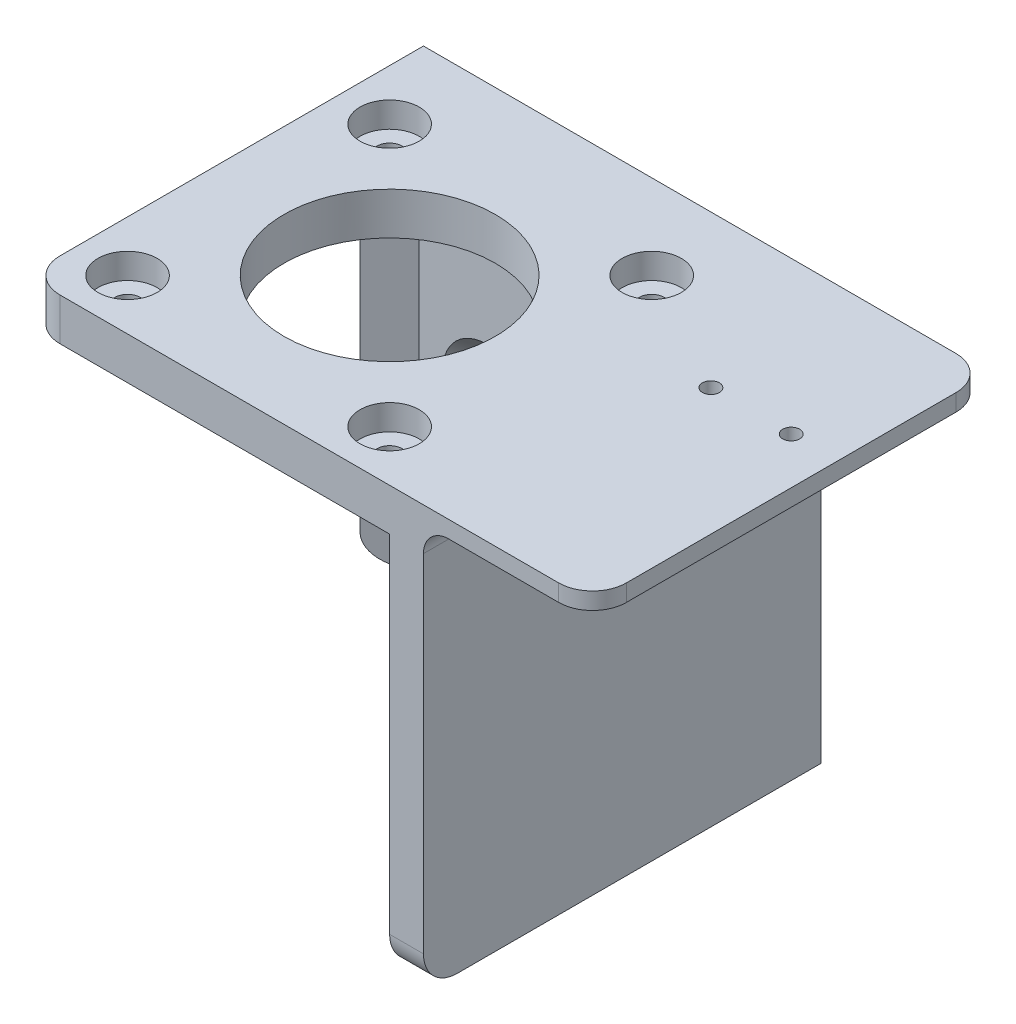
ISO-10303-21;
HEADER;
FILE_DESCRIPTION(('STEP AP214'),'2;1');
FILE_NAME('part.step','',(''),(''),'','','');
FILE_SCHEMA(('AUTOMOTIVE_DESIGN { 1 0 10303 214 1 1 1 1 }'));
ENDSEC;
DATA;
#1=APPLICATION_CONTEXT('core data for automotive mechanical design processes');
#2=APPLICATION_PROTOCOL_DEFINITION('international standard','automotive_design',2000,#1);
#3=PRODUCT_CONTEXT('',#1,'mechanical');
#4=PRODUCT('Part','Part','',(#3));
#5=PRODUCT_RELATED_PRODUCT_CATEGORY('part','',(#4));
#6=PRODUCT_DEFINITION_FORMATION('','',#4);
#7=PRODUCT_DEFINITION_CONTEXT('part definition',#1,'design');
#8=PRODUCT_DEFINITION('design','',#6,#7);
#9=PRODUCT_DEFINITION_SHAPE('','',#8);
#10=(LENGTH_UNIT() NAMED_UNIT(*) SI_UNIT(.MILLI.,.METRE.));
#11=(NAMED_UNIT(*) PLANE_ANGLE_UNIT() SI_UNIT($,.RADIAN.));
#12=(NAMED_UNIT(*) SI_UNIT($,.STERADIAN.) SOLID_ANGLE_UNIT());
#13=UNCERTAINTY_MEASURE_WITH_UNIT(LENGTH_MEASURE(1.E-05),#10,'distance_accuracy_value','');
#14=(GEOMETRIC_REPRESENTATION_CONTEXT(3) GLOBAL_UNCERTAINTY_ASSIGNED_CONTEXT((#13)) GLOBAL_UNIT_ASSIGNED_CONTEXT((#10,
#11,#12)) REPRESENTATION_CONTEXT('',''));
#15=CARTESIAN_POINT('',(0.,0.,0.));
#16=DIRECTION('',(0.,0.,1.));
#17=DIRECTION('',(1.,0.,0.));
#18=AXIS2_PLACEMENT_3D('',#15,#16,#17);
#19=CARTESIAN_POINT('',(0.,50.,0.));
#20=DIRECTION('',(0.,-1.,0.));
#21=DIRECTION('',(0.,0.,-1.));
#22=AXIS2_PLACEMENT_3D('',#19,#20,#21);
#23=PLANE('',#22);
#24=DIRECTION('',(0.,0.,-1.));
#25=VECTOR('',#24,1.);
#26=CARTESIAN_POINT('',(0.,50.,47.));
#27=LINE('',#26,#25);
#28=CARTESIAN_POINT('',(0.,50.,43.));
#29=VERTEX_POINT('',#28);
#30=CARTESIAN_POINT('',(0.,50.,0.));
#31=VERTEX_POINT('',#30);
#32=EDGE_CURVE('E203',#29,#31,#27,.T.);
#33=ORIENTED_EDGE('',*,*,#32,.F.);
#34=CARTESIAN_POINT('',(4.,50.,43.));
#35=DIRECTION('',(0.,-1.,0.));
#36=DIRECTION('',(0.,0.,-1.));
#37=AXIS2_PLACEMENT_3D('',#34,#35,#36);
#38=CIRCLE('',#37,4.);
#39=CARTESIAN_POINT('',(4.,50.,47.));
#40=VERTEX_POINT('',#39);
#41=EDGE_CURVE('E12',#29,#40,#38,.F.);
#42=ORIENTED_EDGE('',*,*,#41,.T.);
#43=DIRECTION('',(1.,0.,0.));
#44=VECTOR('',#43,1.);
#45=CARTESIAN_POINT('',(47.,50.,47.));
#46=LINE('',#45,#44);
#47=CARTESIAN_POINT('',(63.,50.,47.));
#48=VERTEX_POINT('',#47);
#49=EDGE_CURVE('E231',#40,#48,#46,.T.);
#50=ORIENTED_EDGE('',*,*,#49,.T.);
#51=CARTESIAN_POINT('',(63.,50.,43.));
#52=DIRECTION('',(0.,-1.,0.));
#53=DIRECTION('',(0.,0.,-1.));
#54=AXIS2_PLACEMENT_3D('',#51,#52,#53);
#55=CIRCLE('',#54,4.);
#56=CARTESIAN_POINT('',(67.,50.,43.));
#57=VERTEX_POINT('',#56);
#58=EDGE_CURVE('E436',#48,#57,#55,.F.);
#59=ORIENTED_EDGE('',*,*,#58,.T.);
#60=DIRECTION('',(0.,0.,1.));
#61=VECTOR('',#60,1.);
#62=CARTESIAN_POINT('',(67.,50.,0.));
#63=LINE('',#62,#61);
#64=CARTESIAN_POINT('',(67.,50.,4.));
#65=VERTEX_POINT('',#64);
#66=EDGE_CURVE('E713',#65,#57,#63,.T.);
#67=ORIENTED_EDGE('',*,*,#66,.F.);
#68=CARTESIAN_POINT('',(63.,50.,4.));
#69=DIRECTION('',(0.,-1.,0.));
#70=DIRECTION('',(0.,0.,-1.));
#71=AXIS2_PLACEMENT_3D('',#68,#69,#70);
#72=CIRCLE('',#71,4.);
#73=CARTESIAN_POINT('',(63.,50.,0.));
#74=VERTEX_POINT('',#73);
#75=EDGE_CURVE('E229',#65,#74,#72,.F.);
#76=ORIENTED_EDGE('',*,*,#75,.T.);
#77=DIRECTION('',(-1.,0.,0.));
#78=VECTOR('',#77,1.);
#79=CARTESIAN_POINT('',(47.,50.,0.));
#80=LINE('',#79,#78);
#81=EDGE_CURVE('E218',#74,#31,#80,.T.);
#82=ORIENTED_EDGE('',*,*,#81,.T.);
#83=EDGE_LOOP('',(#33,#42,#50,#59,#67,#76,#82));
#84=FACE_BOUND('',#83,.T.);
#85=CARTESIAN_POINT('',(6.,50.,10.));
#86=DIRECTION('',(0.,1.,0.));
#87=DIRECTION('',(0.,0.,1.));
#88=AXIS2_PLACEMENT_3D('',#85,#86,#87);
#89=CIRCLE('',#88,3.5);
#90=CARTESIAN_POINT('',(6.,50.,13.5));
#91=VERTEX_POINT('',#90);
#92=EDGE_CURVE('E232',#91,#91,#89,.T.);
#93=ORIENTED_EDGE('',*,*,#92,.F.);
#94=EDGE_LOOP('',(#93));
#95=FACE_BOUND('',#94,.T.);
#96=CARTESIAN_POINT('',(6.,50.,41.));
#97=DIRECTION('',(0.,1.,0.));
#98=DIRECTION('',(0.,0.,1.));
#99=AXIS2_PLACEMENT_3D('',#96,#97,#98);
#100=CIRCLE('',#99,3.5);
#101=CARTESIAN_POINT('',(6.,50.,44.5));
#102=VERTEX_POINT('',#101);
#103=EDGE_CURVE('E531',#102,#102,#100,.T.);
#104=ORIENTED_EDGE('',*,*,#103,.F.);
#105=EDGE_LOOP('',(#104));
#106=FACE_BOUND('',#105,.T.);
#107=CARTESIAN_POINT('',(37.,50.,10.));
#108=DIRECTION('',(0.,1.,0.));
#109=DIRECTION('',(0.,0.,1.));
#110=AXIS2_PLACEMENT_3D('',#107,#108,#109);
#111=CIRCLE('',#110,3.5);
#112=CARTESIAN_POINT('',(37.,50.,13.5));
#113=VERTEX_POINT('',#112);
#114=EDGE_CURVE('E523',#113,#113,#111,.T.);
#115=ORIENTED_EDGE('',*,*,#114,.F.);
#116=EDGE_LOOP('',(#115));
#117=FACE_BOUND('',#116,.T.);
#118=CARTESIAN_POINT('',(37.,50.,41.));
#119=DIRECTION('',(0.,1.,0.));
#120=DIRECTION('',(0.,0.,1.));
#121=AXIS2_PLACEMENT_3D('',#118,#119,#120);
#122=CIRCLE('',#121,3.5);
#123=CARTESIAN_POINT('',(37.,50.,44.5));
#124=VERTEX_POINT('',#123);
#125=EDGE_CURVE('E515',#124,#124,#122,.T.);
#126=ORIENTED_EDGE('',*,*,#125,.F.);
#127=EDGE_LOOP('',(#126));
#128=FACE_BOUND('',#127,.T.);
#129=CARTESIAN_POINT('',(21.5,50.,25.5));
#130=DIRECTION('',(0.,1.,0.));
#131=DIRECTION('',(0.,0.,1.));
#132=AXIS2_PLACEMENT_3D('',#129,#130,#131);
#133=CIRCLE('',#132,12.5);
#134=CARTESIAN_POINT('',(21.5,50.,38.));
#135=VERTEX_POINT('',#134);
#136=EDGE_CURVE('E503',#135,#135,#133,.T.);
#137=ORIENTED_EDGE('',*,*,#136,.F.);
#138=EDGE_LOOP('',(#137));
#139=FACE_BOUND('',#138,.T.);
#140=CARTESIAN_POINT('',(52.,50.,18.));
#141=DIRECTION('',(0.,1.,0.));
#142=DIRECTION('',(0.,0.,1.));
#143=AXIS2_PLACEMENT_3D('',#140,#141,#142);
#144=CIRCLE('',#143,0.999999999999987);
#145=CARTESIAN_POINT('',(52.,50.,19.));
#146=VERTEX_POINT('',#145);
#147=EDGE_CURVE('E696',#146,#146,#144,.T.);
#148=ORIENTED_EDGE('',*,*,#147,.F.);
#149=EDGE_LOOP('',(#148));
#150=FACE_BOUND('',#149,.T.);
#151=CARTESIAN_POINT('',(61.5,50.,18.));
#152=DIRECTION('',(0.,1.,0.));
#153=DIRECTION('',(0.,0.,1.));
#154=AXIS2_PLACEMENT_3D('',#151,#152,#153);
#155=CIRCLE('',#154,0.999999999999987);
#156=CARTESIAN_POINT('',(61.5,50.,19.));
#157=VERTEX_POINT('',#156);
#158=EDGE_CURVE('E212',#157,#157,#155,.T.);
#159=ORIENTED_EDGE('',*,*,#158,.F.);
#160=EDGE_LOOP('',(#159));
#161=FACE_BOUND('',#160,.T.);
#162=ADVANCED_FACE('F88',(#84,#95,#106,#117,#128,#139,#150,#161),#23,.F.);
#163=CARTESIAN_POINT('',(47.,0.,4.));
#164=DIRECTION('',(-1.,0.,0.));
#165=DIRECTION('',(0.,0.,1.));
#166=AXIS2_PLACEMENT_3D('',#163,#164,#165);
#167=PLANE('',#166);
#168=DIRECTION('',(0.,1.,0.));
#169=VECTOR('',#168,1.);
#170=CARTESIAN_POINT('',(47.,0.,0.));
#171=LINE('',#170,#169);
#172=CARTESIAN_POINT('',(47.,0.,0.));
#173=VERTEX_POINT('',#172);
#174=CARTESIAN_POINT('',(47.,45.,0.));
#175=VERTEX_POINT('',#174);
#176=EDGE_CURVE('E378',#173,#175,#171,.T.);
#177=ORIENTED_EDGE('',*,*,#176,.T.);
#178=DIRECTION('',(0.,0.,-1.));
#179=VECTOR('',#178,1.);
#180=CARTESIAN_POINT('',(47.,45.,47.));
#181=LINE('',#180,#179);
#182=CARTESIAN_POINT('',(47.,45.,47.));
#183=VERTEX_POINT('',#182);
#184=EDGE_CURVE('E446',#175,#183,#181,.F.);
#185=ORIENTED_EDGE('',*,*,#184,.T.);
#186=DIRECTION('',(0.,1.,0.));
#187=VECTOR('',#186,1.);
#188=CARTESIAN_POINT('',(47.,47.,47.));
#189=LINE('',#188,#187);
#190=CARTESIAN_POINT('',(47.,4.,47.));
#191=VERTEX_POINT('',#190);
#192=EDGE_CURVE('E367',#191,#183,#189,.T.);
#193=ORIENTED_EDGE('',*,*,#192,.F.);
#194=CARTESIAN_POINT('',(47.,4.,43.));
#195=DIRECTION('',(-1.,0.,0.));
#196=DIRECTION('',(0.,0.,1.));
#197=AXIS2_PLACEMENT_3D('',#194,#195,#196);
#198=CIRCLE('',#197,4.);
#199=CARTESIAN_POINT('',(47.,0.,43.));
#200=VERTEX_POINT('',#199);
#201=EDGE_CURVE('E410',#191,#200,#198,.F.);
#202=ORIENTED_EDGE('',*,*,#201,.T.);
#203=DIRECTION('',(0.,0.,-1.));
#204=VECTOR('',#203,1.);
#205=CARTESIAN_POINT('',(47.,0.,4.));
#206=LINE('',#205,#204);
#207=EDGE_CURVE('E377',#200,#173,#206,.T.);
#208=ORIENTED_EDGE('',*,*,#207,.T.);
#209=EDGE_LOOP('',(#177,#185,#193,#202,#208));
#210=FACE_BOUND('',#209,.T.);
#211=ADVANCED_FACE('F482',(#210),#167,.F.);
#212=CARTESIAN_POINT('',(0.,47.,4.));
#213=DIRECTION('',(0.,-1.,0.));
#214=DIRECTION('',(0.,0.,-1.));
#215=AXIS2_PLACEMENT_3D('',#212,#213,#214);
#216=PLANE('',#215);
#217=CARTESIAN_POINT('',(37.,47.,41.));
#218=DIRECTION('',(0.,1.,0.));
#219=DIRECTION('',(0.,0.,1.));
#220=AXIS2_PLACEMENT_3D('',#217,#218,#219);
#221=CIRCLE('',#220,1.5);
#222=CARTESIAN_POINT('',(37.,47.,42.5));
#223=VERTEX_POINT('',#222);
#224=EDGE_CURVE('E332',#223,#223,#221,.T.);
#225=ORIENTED_EDGE('',*,*,#224,.F.);
#226=EDGE_LOOP('',(#225));
#227=FACE_BOUND('',#226,.T.);
#228=CARTESIAN_POINT('',(37.,47.,41.));
#229=DIRECTION('',(0.,1.,0.));
#230=DIRECTION('',(0.,0.,1.));
#231=AXIS2_PLACEMENT_3D('',#228,#229,#230);
#232=CIRCLE('',#231,3.5);
#233=CARTESIAN_POINT('',(37.,47.,44.5));
#234=VERTEX_POINT('',#233);
#235=EDGE_CURVE('E509',#234,#234,#232,.T.);
#236=ORIENTED_EDGE('',*,*,#235,.T.);
#237=EDGE_LOOP('',(#236));
#238=FACE_BOUND('',#237,.T.);
#239=ADVANCED_FACE('F564',(#227,#238),#216,.F.);
#240=CARTESIAN_POINT('',(6.,47.,41.));
#241=DIRECTION('',(0.,1.,0.));
#242=DIRECTION('',(0.,0.,1.));
#243=AXIS2_PLACEMENT_3D('',#240,#241,#242);
#244=CIRCLE('',#243,1.5);
#245=CARTESIAN_POINT('',(6.,47.,42.5));
#246=VERTEX_POINT('',#245);
#247=EDGE_CURVE('E340',#246,#246,#244,.T.);
#248=ORIENTED_EDGE('',*,*,#247,.F.);
#249=EDGE_LOOP('',(#248));
#250=FACE_BOUND('',#249,.T.);
#251=CARTESIAN_POINT('',(6.,47.,41.));
#252=DIRECTION('',(0.,1.,0.));
#253=DIRECTION('',(0.,0.,1.));
#254=AXIS2_PLACEMENT_3D('',#251,#252,#253);
#255=CIRCLE('',#254,3.5);
#256=CARTESIAN_POINT('',(6.,47.,44.5));
#257=VERTEX_POINT('',#256);
#258=EDGE_CURVE('E527',#257,#257,#255,.T.);
#259=ORIENTED_EDGE('',*,*,#258,.T.);
#260=EDGE_LOOP('',(#259));
#261=FACE_BOUND('',#260,.T.);
#262=ADVANCED_FACE('F539',(#250,#261),#216,.F.);
#263=CARTESIAN_POINT('',(6.,47.,10.));
#264=DIRECTION('',(0.,1.,0.));
#265=DIRECTION('',(0.,0.,1.));
#266=AXIS2_PLACEMENT_3D('',#263,#264,#265);
#267=CIRCLE('',#266,1.5);
#268=CARTESIAN_POINT('',(6.,47.,11.5));
#269=VERTEX_POINT('',#268);
#270=EDGE_CURVE('E316',#269,#269,#267,.T.);
#271=ORIENTED_EDGE('',*,*,#270,.F.);
#272=EDGE_LOOP('',(#271));
#273=FACE_BOUND('',#272,.T.);
#274=CARTESIAN_POINT('',(6.,47.,10.));
#275=DIRECTION('',(0.,1.,0.));
#276=DIRECTION('',(0.,0.,1.));
#277=AXIS2_PLACEMENT_3D('',#274,#275,#276);
#278=CIRCLE('',#277,3.5);
#279=CARTESIAN_POINT('',(6.,47.,13.5));
#280=VERTEX_POINT('',#279);
#281=EDGE_CURVE('E239',#280,#280,#278,.T.);
#282=ORIENTED_EDGE('',*,*,#281,.T.);
#283=EDGE_LOOP('',(#282));
#284=FACE_BOUND('',#283,.T.);
#285=ADVANCED_FACE('F978',(#273,#284),#216,.F.);
#286=CARTESIAN_POINT('',(37.,47.,10.));
#287=DIRECTION('',(0.,1.,0.));
#288=DIRECTION('',(0.,0.,1.));
#289=AXIS2_PLACEMENT_3D('',#286,#287,#288);
#290=CIRCLE('',#289,1.5);
#291=CARTESIAN_POINT('',(37.,47.,11.5));
#292=VERTEX_POINT('',#291);
#293=EDGE_CURVE('E324',#292,#292,#290,.T.);
#294=ORIENTED_EDGE('',*,*,#293,.F.);
#295=EDGE_LOOP('',(#294));
#296=FACE_BOUND('',#295,.T.);
#297=CARTESIAN_POINT('',(37.,47.,10.));
#298=DIRECTION('',(0.,1.,0.));
#299=DIRECTION('',(0.,0.,1.));
#300=AXIS2_PLACEMENT_3D('',#297,#298,#299);
#301=CIRCLE('',#300,3.5);
#302=CARTESIAN_POINT('',(37.,47.,13.5));
#303=VERTEX_POINT('',#302);
#304=EDGE_CURVE('E519',#303,#303,#301,.T.);
#305=ORIENTED_EDGE('',*,*,#304,.T.);
#306=EDGE_LOOP('',(#305));
#307=FACE_BOUND('',#306,.T.);
#308=ADVANCED_FACE('F634',(#296,#307),#216,.F.);
#309=CARTESIAN_POINT('',(0.,0.,4.));
#310=DIRECTION('',(0.,0.,-1.));
#311=DIRECTION('',(-1.,0.,0.));
#312=AXIS2_PLACEMENT_3D('',#309,#310,#311);
#313=PLANE('',#312);
#314=CARTESIAN_POINT('',(21.5,12.,4.));
#315=DIRECTION('',(0.,0.,1.));
#316=DIRECTION('',(1.,0.,0.));
#317=AXIS2_PLACEMENT_3D('',#314,#315,#316);
#318=CIRCLE('',#317,5.2);
#319=CARTESIAN_POINT('',(26.7,12.,4.));
#320=VERTEX_POINT('',#319);
#321=EDGE_CURVE('E304',#320,#320,#318,.T.);
#322=ORIENTED_EDGE('',*,*,#321,.F.);
#323=EDGE_LOOP('',(#322));
#324=FACE_BOUND('',#323,.T.);
#325=CARTESIAN_POINT('',(31.5,22.,4.));
#326=DIRECTION('',(0.,0.,1.));
#327=DIRECTION('',(1.,0.,0.));
#328=AXIS2_PLACEMENT_3D('',#325,#326,#327);
#329=CIRCLE('',#328,5.2);
#330=CARTESIAN_POINT('',(36.7,22.,4.));
#331=VERTEX_POINT('',#330);
#332=EDGE_CURVE('E292',#331,#331,#329,.T.);
#333=ORIENTED_EDGE('',*,*,#332,.F.);
#334=EDGE_LOOP('',(#333));
#335=FACE_BOUND('',#334,.T.);
#336=CARTESIAN_POINT('',(21.5,32.,4.));
#337=DIRECTION('',(0.,0.,1.));
#338=DIRECTION('',(1.,0.,0.));
#339=AXIS2_PLACEMENT_3D('',#336,#337,#338);
#340=CIRCLE('',#339,5.2);
#341=CARTESIAN_POINT('',(26.7,32.,4.));
#342=VERTEX_POINT('',#341);
#343=EDGE_CURVE('E280',#342,#342,#340,.T.);
#344=ORIENTED_EDGE('',*,*,#343,.F.);
#345=EDGE_LOOP('',(#344));
#346=FACE_BOUND('',#345,.T.);
#347=CARTESIAN_POINT('',(11.5,22.,4.));
#348=DIRECTION('',(0.,0.,1.));
#349=DIRECTION('',(1.,0.,0.));
#350=AXIS2_PLACEMENT_3D('',#347,#348,#349);
#351=CIRCLE('',#350,5.2);
#352=CARTESIAN_POINT('',(16.7,22.,4.));
#353=VERTEX_POINT('',#352);
#354=EDGE_CURVE('E268',#353,#353,#351,.T.);
#355=ORIENTED_EDGE('',*,*,#354,.F.);
#356=EDGE_LOOP('',(#355));
#357=FACE_BOUND('',#356,.T.);
#358=DIRECTION('',(0.,1.,0.));
#359=VECTOR('',#358,1.);
#360=CARTESIAN_POINT('',(3.5,0.,4.));
#361=LINE('',#360,#359);
#362=CARTESIAN_POINT('',(3.5,0.0313730334031148,4.));
#363=VERTEX_POINT('',#362);
#364=CARTESIAN_POINT('',(3.5,45.,4.));
#365=VERTEX_POINT('',#364);
#366=EDGE_CURVE('E250',#363,#365,#361,.T.);
#367=ORIENTED_EDGE('',*,*,#366,.F.);
#368=CARTESIAN_POINT('',(4.,4.,4.));
#369=DIRECTION('',(0.,0.,-1.));
#370=DIRECTION('',(-1.,0.,0.));
#371=AXIS2_PLACEMENT_3D('',#368,#369,#370);
#372=CIRCLE('',#371,4.);
#373=CARTESIAN_POINT('',(4.,0.,4.));
#374=VERTEX_POINT('',#373);
#375=EDGE_CURVE('E407',#363,#374,#372,.F.);
#376=ORIENTED_EDGE('',*,*,#375,.T.);
#377=DIRECTION('',(1.,0.,0.));
#378=VECTOR('',#377,1.);
#379=CARTESIAN_POINT('',(0.,0.,4.));
#380=LINE('',#379,#378);
#381=CARTESIAN_POINT('',(39.5,0.,4.));
#382=VERTEX_POINT('',#381);
#383=EDGE_CURVE('E375',#374,#382,#380,.T.);
#384=ORIENTED_EDGE('',*,*,#383,.T.);
#385=DIRECTION('',(0.,1.,0.));
#386=VECTOR('',#385,1.);
#387=CARTESIAN_POINT('',(39.5,0.,4.));
#388=LINE('',#387,#386);
#389=CARTESIAN_POINT('',(39.5,45.,4.));
#390=VERTEX_POINT('',#389);
#391=EDGE_CURVE('E258',#382,#390,#388,.T.);
#392=ORIENTED_EDGE('',*,*,#391,.T.);
#393=DIRECTION('',(1.,0.,0.));
#394=VECTOR('',#393,1.);
#395=CARTESIAN_POINT('',(0.,45.,4.));
#396=LINE('',#395,#394);
#397=EDGE_CURVE('E363',#365,#390,#396,.T.);
#398=ORIENTED_EDGE('',*,*,#397,.F.);
#399=EDGE_LOOP('',(#367,#376,#384,#392,#398));
#400=FACE_BOUND('',#399,.T.);
#401=ADVANCED_FACE('F630',(#324,#335,#346,#357,#400),#313,.F.);
#402=CARTESIAN_POINT('',(0.,45.,47.));
#403=DIRECTION('',(0.,1.,0.));
#404=DIRECTION('',(0.,0.,1.));
#405=AXIS2_PLACEMENT_3D('',#402,#403,#404);
#406=PLANE('',#405);
#407=CARTESIAN_POINT('',(6.,45.,10.));
#408=DIRECTION('',(0.,1.,0.));
#409=DIRECTION('',(0.,0.,1.));
#410=AXIS2_PLACEMENT_3D('',#407,#408,#409);
#411=CIRCLE('',#410,1.5);
#412=CARTESIAN_POINT('',(6.,45.,11.5));
#413=VERTEX_POINT('',#412);
#414=EDGE_CURVE('E320',#413,#413,#411,.T.);
#415=ORIENTED_EDGE('',*,*,#414,.T.);
#416=EDGE_LOOP('',(#415));
#417=FACE_BOUND('',#416,.T.);
#418=CARTESIAN_POINT('',(37.,45.,10.));
#419=DIRECTION('',(0.,1.,0.));
#420=DIRECTION('',(0.,0.,1.));
#421=AXIS2_PLACEMENT_3D('',#418,#419,#420);
#422=CIRCLE('',#421,1.5);
#423=CARTESIAN_POINT('',(37.,45.,11.5));
#424=VERTEX_POINT('',#423);
#425=EDGE_CURVE('E328',#424,#424,#422,.T.);
#426=ORIENTED_EDGE('',*,*,#425,.T.);
#427=EDGE_LOOP('',(#426));
#428=FACE_BOUND('',#427,.T.);
#429=CARTESIAN_POINT('',(37.,45.,41.));
#430=DIRECTION('',(0.,1.,0.));
#431=DIRECTION('',(0.,0.,1.));
#432=AXIS2_PLACEMENT_3D('',#429,#430,#431);
#433=CIRCLE('',#432,1.5);
#434=CARTESIAN_POINT('',(37.,45.,42.5));
#435=VERTEX_POINT('',#434);
#436=EDGE_CURVE('E336',#435,#435,#433,.T.);
#437=ORIENTED_EDGE('',*,*,#436,.T.);
#438=EDGE_LOOP('',(#437));
#439=FACE_BOUND('',#438,.T.);
#440=CARTESIAN_POINT('',(6.,45.,41.));
#441=DIRECTION('',(0.,1.,0.));
#442=DIRECTION('',(0.,0.,1.));
#443=AXIS2_PLACEMENT_3D('',#440,#441,#442);
#444=CIRCLE('',#443,1.5);
#445=CARTESIAN_POINT('',(6.,45.,42.5));
#446=VERTEX_POINT('',#445);
#447=EDGE_CURVE('E344',#446,#446,#444,.T.);
#448=ORIENTED_EDGE('',*,*,#447,.T.);
#449=EDGE_LOOP('',(#448));
#450=FACE_BOUND('',#449,.T.);
#451=CARTESIAN_POINT('',(21.5,45.,25.5));
#452=DIRECTION('',(0.,-1.,0.));
#453=DIRECTION('',(0.,0.,-1.));
#454=AXIS2_PLACEMENT_3D('',#451,#452,#453);
#455=CIRCLE('',#454,12.5);
#456=CARTESIAN_POINT('',(21.5,45.,13.));
#457=VERTEX_POINT('',#456);
#458=EDGE_CURVE('E348',#457,#457,#455,.T.);
#459=ORIENTED_EDGE('',*,*,#458,.F.);
#460=EDGE_LOOP('',(#459));
#461=FACE_BOUND('',#460,.T.);
#462=DIRECTION('',(1.,0.,0.));
#463=VECTOR('',#462,1.);
#464=CARTESIAN_POINT('',(0.,45.,47.));
#465=LINE('',#464,#463);
#466=CARTESIAN_POINT('',(4.,45.,47.));
#467=VERTEX_POINT('',#466);
#468=CARTESIAN_POINT('',(43.,45.,47.));
#469=VERTEX_POINT('',#468);
#470=EDGE_CURVE('E364',#467,#469,#465,.T.);
#471=ORIENTED_EDGE('',*,*,#470,.F.);
#472=CARTESIAN_POINT('',(4.,45.,43.));
#473=DIRECTION('',(0.,1.,0.));
#474=DIRECTION('',(0.,0.,1.));
#475=AXIS2_PLACEMENT_3D('',#472,#473,#474);
#476=CIRCLE('',#475,4.);
#477=CARTESIAN_POINT('',(0.,45.,43.));
#478=VERTEX_POINT('',#477);
#479=EDGE_CURVE('E111',#467,#478,#476,.F.);
#480=ORIENTED_EDGE('',*,*,#479,.T.);
#481=DIRECTION('',(0.,0.,-1.));
#482=VECTOR('',#481,1.);
#483=CARTESIAN_POINT('',(0.,45.,47.));
#484=LINE('',#483,#482);
#485=CARTESIAN_POINT('',(0.,45.,7.5));
#486=VERTEX_POINT('',#485);
#487=EDGE_CURVE('E225',#478,#486,#484,.T.);
#488=ORIENTED_EDGE('',*,*,#487,.T.);
#489=DIRECTION('',(-0.707106781186548,0.,0.707106781186547));
#490=VECTOR('',#489,1.);
#491=CARTESIAN_POINT('',(3.5,45.,4.));
#492=LINE('',#491,#490);
#493=EDGE_CURVE('E236',#365,#486,#492,.T.);
#494=ORIENTED_EDGE('',*,*,#493,.F.);
#495=ORIENTED_EDGE('',*,*,#397,.T.);
#496=DIRECTION('',(-0.707106781186548,0.,-0.707106781186547));
#497=VECTOR('',#496,1.);
#498=CARTESIAN_POINT('',(39.5,45.,4.));
#499=LINE('',#498,#497);
#500=CARTESIAN_POINT('',(43.,45.,7.5));
#501=VERTEX_POINT('',#500);
#502=EDGE_CURVE('E253',#501,#390,#499,.T.);
#503=ORIENTED_EDGE('',*,*,#502,.F.);
#504=DIRECTION('',(0.,0.,-1.));
#505=VECTOR('',#504,1.);
#506=CARTESIAN_POINT('',(43.,45.,47.));
#507=LINE('',#506,#505);
#508=EDGE_CURVE('E359',#469,#501,#507,.T.);
#509=ORIENTED_EDGE('',*,*,#508,.F.);
#510=EDGE_LOOP('',(#471,#480,#488,#494,#495,#503,#509));
#511=FACE_BOUND('',#510,.T.);
#512=ADVANCED_FACE('F468',(#417,#428,#439,#450,#461,#511),#406,.F.);
#513=CARTESIAN_POINT('',(43.,45.,47.));
#514=DIRECTION('',(1.,0.,0.));
#515=DIRECTION('',(0.,1.,0.));
#516=AXIS2_PLACEMENT_3D('',#513,#514,#515);
#517=PLANE('',#516);
#518=DIRECTION('',(0.,0.,-1.));
#519=VECTOR('',#518,1.);
#520=CARTESIAN_POINT('',(43.,0.,47.));
#521=LINE('',#520,#519);
#522=CARTESIAN_POINT('',(43.,0.,43.));
#523=VERTEX_POINT('',#522);
#524=CARTESIAN_POINT('',(43.,0.,7.5));
#525=VERTEX_POINT('',#524);
#526=EDGE_CURVE('E356',#523,#525,#521,.T.);
#527=ORIENTED_EDGE('',*,*,#526,.F.);
#528=CARTESIAN_POINT('',(43.,4.,43.));
#529=DIRECTION('',(1.,0.,0.));
#530=DIRECTION('',(0.,1.,0.));
#531=AXIS2_PLACEMENT_3D('',#528,#529,#530);
#532=CIRCLE('',#531,4.);
#533=CARTESIAN_POINT('',(43.,4.00000000000002,47.));
#534=VERTEX_POINT('',#533);
#535=EDGE_CURVE('E413',#523,#534,#532,.F.);
#536=ORIENTED_EDGE('',*,*,#535,.T.);
#537=DIRECTION('',(0.,-1.,0.));
#538=VECTOR('',#537,1.);
#539=CARTESIAN_POINT('',(43.,45.,47.));
#540=LINE('',#539,#538);
#541=EDGE_CURVE('E352',#469,#534,#540,.T.);
#542=ORIENTED_EDGE('',*,*,#541,.F.);
#543=ORIENTED_EDGE('',*,*,#508,.T.);
#544=DIRECTION('',(0.,1.,0.));
#545=VECTOR('',#544,1.);
#546=CARTESIAN_POINT('',(43.,0.,7.5));
#547=LINE('',#546,#545);
#548=EDGE_CURVE('E265',#525,#501,#547,.T.);
#549=ORIENTED_EDGE('',*,*,#548,.F.);
#550=EDGE_LOOP('',(#527,#536,#542,#543,#549));
#551=FACE_BOUND('',#550,.T.);
#552=ADVANCED_FACE('F473',(#551),#517,.F.);
#553=CARTESIAN_POINT('',(0.,0.,4.));
#554=DIRECTION('',(1.,0.,0.));
#555=DIRECTION('',(0.,0.,-1.));
#556=AXIS2_PLACEMENT_3D('',#553,#554,#555);
#557=PLANE('',#556);
#558=ORIENTED_EDGE('',*,*,#487,.F.);
#559=DIRECTION('',(0.,-1.,0.));
#560=VECTOR('',#559,1.);
#561=CARTESIAN_POINT('',(0.,50.,43.));
#562=LINE('',#561,#560);
#563=EDGE_CURVE('E97',#478,#29,#562,.F.);
#564=ORIENTED_EDGE('',*,*,#563,.T.);
#565=ORIENTED_EDGE('',*,*,#32,.T.);
#566=DIRECTION('',(0.,-1.,0.));
#567=VECTOR('',#566,1.);
#568=CARTESIAN_POINT('',(0.,0.,0.));
#569=LINE('',#568,#567);
#570=CARTESIAN_POINT('',(0.,4.,0.));
#571=VERTEX_POINT('',#570);
#572=EDGE_CURVE('E206',#31,#571,#569,.T.);
#573=ORIENTED_EDGE('',*,*,#572,.T.);
#574=DIRECTION('',(0.,0.,-1.));
#575=VECTOR('',#574,1.);
#576=CARTESIAN_POINT('',(0.,4.,4.));
#577=LINE('',#576,#575);
#578=CARTESIAN_POINT('',(0.,4.,7.5));
#579=VERTEX_POINT('',#578);
#580=EDGE_CURVE('E401',#571,#579,#577,.F.);
#581=ORIENTED_EDGE('',*,*,#580,.T.);
#582=DIRECTION('',(0.,1.,0.));
#583=VECTOR('',#582,1.);
#584=CARTESIAN_POINT('',(0.,0.,7.5));
#585=LINE('',#584,#583);
#586=EDGE_CURVE('E246',#579,#486,#585,.T.);
#587=ORIENTED_EDGE('',*,*,#586,.T.);
#588=EDGE_LOOP('',(#558,#564,#565,#573,#581,#587));
#589=FACE_BOUND('',#588,.T.);
#590=ADVANCED_FACE('F205',(#589),#557,.F.);
#591=CARTESIAN_POINT('',(0.,0.,4.));
#592=DIRECTION('',(0.,1.,0.));
#593=DIRECTION('',(0.,0.,1.));
#594=AXIS2_PLACEMENT_3D('',#591,#592,#593);
#595=PLANE('',#594);
#596=ORIENTED_EDGE('',*,*,#383,.F.);
#597=DIRECTION('',(0.,0.,-1.));
#598=VECTOR('',#597,1.);
#599=CARTESIAN_POINT('',(4.,0.,4.));
#600=LINE('',#599,#598);
#601=CARTESIAN_POINT('',(4.,0.,0.));
#602=VERTEX_POINT('',#601);
#603=EDGE_CURVE('E397',#374,#602,#600,.T.);
#604=ORIENTED_EDGE('',*,*,#603,.T.);
#605=DIRECTION('',(1.,0.,0.));
#606=VECTOR('',#605,1.);
#607=CARTESIAN_POINT('',(0.,0.,0.));
#608=LINE('',#607,#606);
#609=EDGE_CURVE('E224',#602,#173,#608,.T.);
#610=ORIENTED_EDGE('',*,*,#609,.T.);
#611=ORIENTED_EDGE('',*,*,#207,.F.);
#612=DIRECTION('',(1.,0.,0.));
#613=VECTOR('',#612,1.);
#614=CARTESIAN_POINT('',(43.,0.,43.));
#615=LINE('',#614,#613);
#616=EDGE_CURVE('E394',#200,#523,#615,.F.);
#617=ORIENTED_EDGE('',*,*,#616,.T.);
#618=ORIENTED_EDGE('',*,*,#526,.T.);
#619=DIRECTION('',(-0.707106781186548,0.,-0.707106781186547));
#620=VECTOR('',#619,1.);
#621=CARTESIAN_POINT('',(39.5,0.,4.));
#622=LINE('',#621,#620);
#623=EDGE_CURVE('E254',#525,#382,#622,.T.);
#624=ORIENTED_EDGE('',*,*,#623,.T.);
#625=EDGE_LOOP('',(#596,#604,#610,#611,#617,#618,#624));
#626=FACE_BOUND('',#625,.T.);
#627=ADVANCED_FACE('F485',(#626),#595,.F.);
#628=CARTESIAN_POINT('',(0.,0.,0.));
#629=DIRECTION('',(0.,0.,-1.));
#630=DIRECTION('',(-1.,0.,0.));
#631=AXIS2_PLACEMENT_3D('',#628,#629,#630);
#632=PLANE('',#631);
#633=ORIENTED_EDGE('',*,*,#572,.F.);
#634=ORIENTED_EDGE('',*,*,#81,.F.);
#635=DIRECTION('',(0.,1.,0.));
#636=VECTOR('',#635,1.);
#637=CARTESIAN_POINT('',(63.,48.,0.));
#638=LINE('',#637,#636);
#639=CARTESIAN_POINT('',(63.,48.,0.));
#640=VERTEX_POINT('',#639);
#641=EDGE_CURVE('E439',#74,#640,#638,.F.);
#642=ORIENTED_EDGE('',*,*,#641,.T.);
#643=DIRECTION('',(-1.,0.,0.));
#644=VECTOR('',#643,1.);
#645=CARTESIAN_POINT('',(67.,48.,0.));
#646=LINE('',#645,#644);
#647=CARTESIAN_POINT('',(50.,48.,0.));
#648=VERTEX_POINT('',#647);
#649=EDGE_CURVE('E504',#640,#648,#646,.T.);
#650=ORIENTED_EDGE('',*,*,#649,.T.);
#651=CARTESIAN_POINT('',(50.,45.,0.));
#652=DIRECTION('',(0.,0.,-1.));
#653=DIRECTION('',(-1.,0.,0.));
#654=AXIS2_PLACEMENT_3D('',#651,#652,#653);
#655=CIRCLE('',#654,3.);
#656=EDGE_CURVE('E449',#648,#175,#655,.F.);
#657=ORIENTED_EDGE('',*,*,#656,.T.);
#658=ORIENTED_EDGE('',*,*,#176,.F.);
#659=ORIENTED_EDGE('',*,*,#609,.F.);
#660=CARTESIAN_POINT('',(4.,4.,0.));
#661=DIRECTION('',(0.,0.,-1.));
#662=DIRECTION('',(-1.,0.,0.));
#663=AXIS2_PLACEMENT_3D('',#660,#661,#662);
#664=CIRCLE('',#663,4.);
#665=EDGE_CURVE('E221',#602,#571,#664,.T.);
#666=ORIENTED_EDGE('',*,*,#665,.T.);
#667=EDGE_LOOP('',(#633,#634,#642,#650,#657,#658,#659,#666));
#668=FACE_BOUND('',#667,.T.);
#669=CARTESIAN_POINT('',(11.5,22.,0.));
#670=DIRECTION('',(0.,0.,-1.));
#671=DIRECTION('',(-1.,0.,0.));
#672=AXIS2_PLACEMENT_3D('',#669,#670,#671);
#673=CIRCLE('',#672,2.75);
#674=CARTESIAN_POINT('',(8.75,22.,0.));
#675=VERTEX_POINT('',#674);
#676=EDGE_CURVE('E276',#675,#675,#673,.T.);
#677=ORIENTED_EDGE('',*,*,#676,.F.);
#678=EDGE_LOOP('',(#677));
#679=FACE_BOUND('',#678,.T.);
#680=CARTESIAN_POINT('',(21.5,32.,0.));
#681=DIRECTION('',(0.,0.,-1.));
#682=DIRECTION('',(-1.,0.,0.));
#683=AXIS2_PLACEMENT_3D('',#680,#681,#682);
#684=CIRCLE('',#683,2.75);
#685=CARTESIAN_POINT('',(18.75,32.,0.));
#686=VERTEX_POINT('',#685);
#687=EDGE_CURVE('E288',#686,#686,#684,.T.);
#688=ORIENTED_EDGE('',*,*,#687,.F.);
#689=EDGE_LOOP('',(#688));
#690=FACE_BOUND('',#689,.T.);
#691=CARTESIAN_POINT('',(31.5,22.,0.));
#692=DIRECTION('',(0.,0.,-1.));
#693=DIRECTION('',(-1.,0.,0.));
#694=AXIS2_PLACEMENT_3D('',#691,#692,#693);
#695=CIRCLE('',#694,2.75);
#696=CARTESIAN_POINT('',(28.75,22.,0.));
#697=VERTEX_POINT('',#696);
#698=EDGE_CURVE('E300',#697,#697,#695,.T.);
#699=ORIENTED_EDGE('',*,*,#698,.F.);
#700=EDGE_LOOP('',(#699));
#701=FACE_BOUND('',#700,.T.);
#702=CARTESIAN_POINT('',(21.5,12.,0.));
#703=DIRECTION('',(0.,0.,-1.));
#704=DIRECTION('',(-1.,0.,0.));
#705=AXIS2_PLACEMENT_3D('',#702,#703,#704);
#706=CIRCLE('',#705,2.75);
#707=CARTESIAN_POINT('',(18.75,12.,0.));
#708=VERTEX_POINT('',#707);
#709=EDGE_CURVE('E312',#708,#708,#706,.T.);
#710=ORIENTED_EDGE('',*,*,#709,.F.);
#711=EDGE_LOOP('',(#710));
#712=FACE_BOUND('',#711,.T.);
#713=ADVANCED_FACE('F216',(#668,#679,#690,#701,#712),#632,.T.);
#714=CARTESIAN_POINT('',(0.,0.,47.));
#715=DIRECTION('',(0.,0.,1.));
#716=DIRECTION('',(1.,0.,0.));
#717=AXIS2_PLACEMENT_3D('',#714,#715,#716);
#718=PLANE('',#717);
#719=ORIENTED_EDGE('',*,*,#49,.F.);
#720=DIRECTION('',(0.,-1.,0.));
#721=VECTOR('',#720,1.);
#722=CARTESIAN_POINT('',(4.,45.,47.));
#723=LINE('',#722,#721);
#724=EDGE_CURVE('E455',#40,#467,#723,.T.);
#725=ORIENTED_EDGE('',*,*,#724,.T.);
#726=ORIENTED_EDGE('',*,*,#470,.T.);
#727=ORIENTED_EDGE('',*,*,#541,.T.);
#728=DIRECTION('',(1.,0.,0.));
#729=VECTOR('',#728,1.);
#730=CARTESIAN_POINT('',(47.,4.,47.));
#731=LINE('',#730,#729);
#732=EDGE_CURVE('E388',#534,#191,#731,.T.);
#733=ORIENTED_EDGE('',*,*,#732,.T.);
#734=ORIENTED_EDGE('',*,*,#192,.T.);
#735=CARTESIAN_POINT('',(50.,45.,47.));
#736=DIRECTION('',(0.,0.,1.));
#737=DIRECTION('',(1.,0.,0.));
#738=AXIS2_PLACEMENT_3D('',#735,#736,#737);
#739=CIRCLE('',#738,3.);
#740=CARTESIAN_POINT('',(50.,48.,47.));
#741=VERTEX_POINT('',#740);
#742=EDGE_CURVE('E452',#183,#741,#739,.F.);
#743=ORIENTED_EDGE('',*,*,#742,.T.);
#744=DIRECTION('',(-1.,0.,0.));
#745=VECTOR('',#744,1.);
#746=CARTESIAN_POINT('',(67.,48.,47.));
#747=LINE('',#746,#745);
#748=CARTESIAN_POINT('',(63.,48.,47.));
#749=VERTEX_POINT('',#748);
#750=EDGE_CURVE('E496',#749,#741,#747,.T.);
#751=ORIENTED_EDGE('',*,*,#750,.F.);
#752=DIRECTION('',(0.,-1.,0.));
#753=VECTOR('',#752,1.);
#754=CARTESIAN_POINT('',(63.,50.,47.));
#755=LINE('',#754,#753);
#756=EDGE_CURVE('E430',#749,#48,#755,.F.);
#757=ORIENTED_EDGE('',*,*,#756,.T.);
#758=EDGE_LOOP('',(#719,#725,#726,#727,#733,#734,#743,#751,#757));
#759=FACE_BOUND('',#758,.T.);
#760=ADVANCED_FACE('F464',(#759),#718,.T.);
#761=CARTESIAN_POINT('',(21.5,47.,25.5));
#762=DIRECTION('',(0.,-1.,0.));
#763=DIRECTION('',(0.,0.,-1.));
#764=AXIS2_PLACEMENT_3D('',#761,#762,#763);
#765=CYLINDRICAL_SURFACE('',#764,12.5);
#766=ORIENTED_EDGE('',*,*,#458,.T.);
#767=EDGE_LOOP('',(#766));
#768=FACE_BOUND('',#767,.T.);
#769=ORIENTED_EDGE('',*,*,#136,.T.);
#770=EDGE_LOOP('',(#769));
#771=FACE_BOUND('',#770,.T.);
#772=ADVANCED_FACE('F620',(#768,#771),#765,.F.);
#773=CARTESIAN_POINT('',(6.,47.,41.));
#774=DIRECTION('',(0.,1.,0.));
#775=DIRECTION('',(0.,0.,1.));
#776=AXIS2_PLACEMENT_3D('',#773,#774,#775);
#777=CYLINDRICAL_SURFACE('',#776,1.5);
#778=ORIENTED_EDGE('',*,*,#447,.F.);
#779=EDGE_LOOP('',(#778));
#780=FACE_BOUND('',#779,.T.);
#781=ORIENTED_EDGE('',*,*,#247,.T.);
#782=EDGE_LOOP('',(#781));
#783=FACE_BOUND('',#782,.T.);
#784=ADVANCED_FACE('F616',(#780,#783),#777,.F.);
#785=CARTESIAN_POINT('',(37.,47.,41.));
#786=DIRECTION('',(0.,1.,0.));
#787=DIRECTION('',(0.,0.,1.));
#788=AXIS2_PLACEMENT_3D('',#785,#786,#787);
#789=CYLINDRICAL_SURFACE('',#788,1.5);
#790=ORIENTED_EDGE('',*,*,#436,.F.);
#791=EDGE_LOOP('',(#790));
#792=FACE_BOUND('',#791,.T.);
#793=ORIENTED_EDGE('',*,*,#224,.T.);
#794=EDGE_LOOP('',(#793));
#795=FACE_BOUND('',#794,.T.);
#796=ADVANCED_FACE('F612',(#792,#795),#789,.F.);
#797=CARTESIAN_POINT('',(37.,47.,10.));
#798=DIRECTION('',(0.,1.,0.));
#799=DIRECTION('',(0.,0.,1.));
#800=AXIS2_PLACEMENT_3D('',#797,#798,#799);
#801=CYLINDRICAL_SURFACE('',#800,1.5);
#802=ORIENTED_EDGE('',*,*,#425,.F.);
#803=EDGE_LOOP('',(#802));
#804=FACE_BOUND('',#803,.T.);
#805=ORIENTED_EDGE('',*,*,#293,.T.);
#806=EDGE_LOOP('',(#805));
#807=FACE_BOUND('',#806,.T.);
#808=ADVANCED_FACE('F608',(#804,#807),#801,.F.);
#809=CARTESIAN_POINT('',(6.,47.,10.));
#810=DIRECTION('',(0.,1.,0.));
#811=DIRECTION('',(0.,0.,1.));
#812=AXIS2_PLACEMENT_3D('',#809,#810,#811);
#813=CYLINDRICAL_SURFACE('',#812,1.5);
#814=ORIENTED_EDGE('',*,*,#414,.F.);
#815=EDGE_LOOP('',(#814));
#816=FACE_BOUND('',#815,.T.);
#817=ORIENTED_EDGE('',*,*,#270,.T.);
#818=EDGE_LOOP('',(#817));
#819=FACE_BOUND('',#818,.T.);
#820=ADVANCED_FACE('F604',(#816,#819),#813,.F.);
#821=CARTESIAN_POINT('',(21.5,12.,4.));
#822=DIRECTION('',(0.,0.,1.));
#823=DIRECTION('',(1.,0.,0.));
#824=AXIS2_PLACEMENT_3D('',#821,#822,#823);
#825=CYLINDRICAL_SURFACE('',#824,2.75);
#826=CARTESIAN_POINT('',(21.5,12.,1.55));
#827=DIRECTION('',(0.,0.,1.));
#828=DIRECTION('',(1.,0.,0.));
#829=AXIS2_PLACEMENT_3D('',#826,#827,#828);
#830=CIRCLE('',#829,2.75);
#831=CARTESIAN_POINT('',(24.25,12.,1.55));
#832=VERTEX_POINT('',#831);
#833=EDGE_CURVE('E308',#832,#832,#830,.T.);
#834=ORIENTED_EDGE('',*,*,#833,.T.);
#835=EDGE_LOOP('',(#834));
#836=FACE_BOUND('',#835,.T.);
#837=ORIENTED_EDGE('',*,*,#709,.T.);
#838=EDGE_LOOP('',(#837));
#839=FACE_BOUND('',#838,.T.);
#840=ADVANCED_FACE('F600',(#836,#839),#825,.F.);
#841=CARTESIAN_POINT('',(21.5,12.,4.));
#842=DIRECTION('',(0.,0.,1.));
#843=DIRECTION('',(1.,0.,0.));
#844=AXIS2_PLACEMENT_3D('',#841,#842,#843);
#845=CONICAL_SURFACE('',#844,5.2,0.785398163397448);
#846=ORIENTED_EDGE('',*,*,#833,.F.);
#847=EDGE_LOOP('',(#846));
#848=FACE_BOUND('',#847,.T.);
#849=ORIENTED_EDGE('',*,*,#321,.T.);
#850=EDGE_LOOP('',(#849));
#851=FACE_BOUND('',#850,.T.);
#852=ADVANCED_FACE('F596',(#848,#851),#845,.F.);
#853=CARTESIAN_POINT('',(31.5,22.,4.));
#854=DIRECTION('',(0.,0.,1.));
#855=DIRECTION('',(1.,0.,0.));
#856=AXIS2_PLACEMENT_3D('',#853,#854,#855);
#857=CYLINDRICAL_SURFACE('',#856,2.75);
#858=CARTESIAN_POINT('',(31.5,22.,1.55));
#859=DIRECTION('',(0.,0.,1.));
#860=DIRECTION('',(1.,0.,0.));
#861=AXIS2_PLACEMENT_3D('',#858,#859,#860);
#862=CIRCLE('',#861,2.75);
#863=CARTESIAN_POINT('',(34.25,22.,1.55));
#864=VERTEX_POINT('',#863);
#865=EDGE_CURVE('E296',#864,#864,#862,.T.);
#866=ORIENTED_EDGE('',*,*,#865,.T.);
#867=EDGE_LOOP('',(#866));
#868=FACE_BOUND('',#867,.T.);
#869=ORIENTED_EDGE('',*,*,#698,.T.);
#870=EDGE_LOOP('',(#869));
#871=FACE_BOUND('',#870,.T.);
#872=ADVANCED_FACE('F592',(#868,#871),#857,.F.);
#873=CARTESIAN_POINT('',(31.5,22.,4.));
#874=DIRECTION('',(0.,0.,1.));
#875=DIRECTION('',(1.,0.,0.));
#876=AXIS2_PLACEMENT_3D('',#873,#874,#875);
#877=CONICAL_SURFACE('',#876,5.2,0.785398163397448);
#878=ORIENTED_EDGE('',*,*,#865,.F.);
#879=EDGE_LOOP('',(#878));
#880=FACE_BOUND('',#879,.T.);
#881=ORIENTED_EDGE('',*,*,#332,.T.);
#882=EDGE_LOOP('',(#881));
#883=FACE_BOUND('',#882,.T.);
#884=ADVANCED_FACE('F588',(#880,#883),#877,.F.);
#885=CARTESIAN_POINT('',(21.5,32.,4.));
#886=DIRECTION('',(0.,0.,1.));
#887=DIRECTION('',(1.,0.,0.));
#888=AXIS2_PLACEMENT_3D('',#885,#886,#887);
#889=CYLINDRICAL_SURFACE('',#888,2.75);
#890=CARTESIAN_POINT('',(21.5,32.,1.55));
#891=DIRECTION('',(0.,0.,1.));
#892=DIRECTION('',(1.,0.,0.));
#893=AXIS2_PLACEMENT_3D('',#890,#891,#892);
#894=CIRCLE('',#893,2.75);
#895=CARTESIAN_POINT('',(24.25,32.,1.55));
#896=VERTEX_POINT('',#895);
#897=EDGE_CURVE('E284',#896,#896,#894,.T.);
#898=ORIENTED_EDGE('',*,*,#897,.T.);
#899=EDGE_LOOP('',(#898));
#900=FACE_BOUND('',#899,.T.);
#901=ORIENTED_EDGE('',*,*,#687,.T.);
#902=EDGE_LOOP('',(#901));
#903=FACE_BOUND('',#902,.T.);
#904=ADVANCED_FACE('F584',(#900,#903),#889,.F.);
#905=CARTESIAN_POINT('',(21.5,32.,4.));
#906=DIRECTION('',(0.,0.,1.));
#907=DIRECTION('',(1.,0.,0.));
#908=AXIS2_PLACEMENT_3D('',#905,#906,#907);
#909=CONICAL_SURFACE('',#908,5.2,0.785398163397448);
#910=ORIENTED_EDGE('',*,*,#897,.F.);
#911=EDGE_LOOP('',(#910));
#912=FACE_BOUND('',#911,.T.);
#913=ORIENTED_EDGE('',*,*,#343,.T.);
#914=EDGE_LOOP('',(#913));
#915=FACE_BOUND('',#914,.T.);
#916=ADVANCED_FACE('F580',(#912,#915),#909,.F.);
#917=CARTESIAN_POINT('',(11.5,22.,4.));
#918=DIRECTION('',(0.,0.,1.));
#919=DIRECTION('',(1.,0.,0.));
#920=AXIS2_PLACEMENT_3D('',#917,#918,#919);
#921=CYLINDRICAL_SURFACE('',#920,2.75);
#922=CARTESIAN_POINT('',(11.5,22.,1.55));
#923=DIRECTION('',(0.,0.,1.));
#924=DIRECTION('',(1.,0.,0.));
#925=AXIS2_PLACEMENT_3D('',#922,#923,#924);
#926=CIRCLE('',#925,2.75);
#927=CARTESIAN_POINT('',(14.25,22.,1.55));
#928=VERTEX_POINT('',#927);
#929=EDGE_CURVE('E272',#928,#928,#926,.T.);
#930=ORIENTED_EDGE('',*,*,#929,.T.);
#931=EDGE_LOOP('',(#930));
#932=FACE_BOUND('',#931,.T.);
#933=ORIENTED_EDGE('',*,*,#676,.T.);
#934=EDGE_LOOP('',(#933));
#935=FACE_BOUND('',#934,.T.);
#936=ADVANCED_FACE('F576',(#932,#935),#921,.F.);
#937=CARTESIAN_POINT('',(11.5,22.,4.));
#938=DIRECTION('',(0.,0.,1.));
#939=DIRECTION('',(1.,0.,0.));
#940=AXIS2_PLACEMENT_3D('',#937,#938,#939);
#941=CONICAL_SURFACE('',#940,5.2,0.785398163397449);
#942=ORIENTED_EDGE('',*,*,#929,.F.);
#943=EDGE_LOOP('',(#942));
#944=FACE_BOUND('',#943,.T.);
#945=ORIENTED_EDGE('',*,*,#354,.T.);
#946=EDGE_LOOP('',(#945));
#947=FACE_BOUND('',#946,.T.);
#948=ADVANCED_FACE('F572',(#944,#947),#941,.F.);
#949=CARTESIAN_POINT('',(39.5,0.,4.));
#950=DIRECTION('',(0.707106781186547,0.,-0.707106781186548));
#951=DIRECTION('',(-0.707106781186548,0.,-0.707106781186547));
#952=AXIS2_PLACEMENT_3D('',#949,#950,#951);
#953=PLANE('',#952);
#954=ORIENTED_EDGE('',*,*,#502,.T.);
#955=ORIENTED_EDGE('',*,*,#391,.F.);
#956=ORIENTED_EDGE('',*,*,#623,.F.);
#957=ORIENTED_EDGE('',*,*,#548,.T.);
#958=EDGE_LOOP('',(#954,#955,#956,#957));
#959=FACE_BOUND('',#958,.T.);
#960=ADVANCED_FACE('F568',(#959),#953,.F.);
#961=CARTESIAN_POINT('',(3.5,0.,4.));
#962=DIRECTION('',(-0.707106781186547,0.,-0.707106781186548));
#963=DIRECTION('',(-0.707106781186548,0.,0.707106781186547));
#964=AXIS2_PLACEMENT_3D('',#961,#962,#963);
#965=PLANE('',#964);
#966=ORIENTED_EDGE('',*,*,#586,.F.);
#967=CARTESIAN_POINT('',(4.,4.,3.5));
#968=DIRECTION('',(-0.707106781186547,0.,-0.707106781186548));
#969=DIRECTION('',(0.707106781186548,0.,-0.707106781186547));
#970=AXIS2_PLACEMENT_3D('',#967,#968,#969);
#971=ELLIPSE('',#970,5.65685424949238,4.);
#972=EDGE_CURVE('E404',#579,#363,#971,.F.);
#973=ORIENTED_EDGE('',*,*,#972,.T.);
#974=ORIENTED_EDGE('',*,*,#366,.T.);
#975=ORIENTED_EDGE('',*,*,#493,.T.);
#976=EDGE_LOOP('',(#966,#973,#974,#975));
#977=FACE_BOUND('',#976,.T.);
#978=ADVANCED_FACE('F554',(#977),#965,.F.);
#979=CARTESIAN_POINT('',(6.,50.,10.));
#980=DIRECTION('',(0.,-1.,0.));
#981=DIRECTION('',(0.,0.,-1.));
#982=AXIS2_PLACEMENT_3D('',#979,#980,#981);
#983=CYLINDRICAL_SURFACE('',#982,3.5);
#984=ORIENTED_EDGE('',*,*,#92,.T.);
#985=EDGE_LOOP('',(#984));
#986=FACE_BOUND('',#985,.T.);
#987=ORIENTED_EDGE('',*,*,#281,.F.);
#988=EDGE_LOOP('',(#987));
#989=FACE_BOUND('',#988,.T.);
#990=ADVANCED_FACE('F544',(#986,#989),#983,.F.);
#991=CARTESIAN_POINT('',(6.,50.,41.));
#992=DIRECTION('',(0.,-1.,0.));
#993=DIRECTION('',(0.,0.,-1.));
#994=AXIS2_PLACEMENT_3D('',#991,#992,#993);
#995=CYLINDRICAL_SURFACE('',#994,3.5);
#996=ORIENTED_EDGE('',*,*,#103,.T.);
#997=EDGE_LOOP('',(#996));
#998=FACE_BOUND('',#997,.T.);
#999=ORIENTED_EDGE('',*,*,#258,.F.);
#1000=EDGE_LOOP('',(#999));
#1001=FACE_BOUND('',#1000,.T.);
#1002=ADVANCED_FACE('F541',(#998,#1001),#995,.F.);
#1003=CARTESIAN_POINT('',(37.,50.,10.));
#1004=DIRECTION('',(0.,-1.,0.));
#1005=DIRECTION('',(0.,0.,-1.));
#1006=AXIS2_PLACEMENT_3D('',#1003,#1004,#1005);
#1007=CYLINDRICAL_SURFACE('',#1006,3.5);
#1008=ORIENTED_EDGE('',*,*,#114,.T.);
#1009=EDGE_LOOP('',(#1008));
#1010=FACE_BOUND('',#1009,.T.);
#1011=ORIENTED_EDGE('',*,*,#304,.F.);
#1012=EDGE_LOOP('',(#1011));
#1013=FACE_BOUND('',#1012,.T.);
#1014=ADVANCED_FACE('F543',(#1010,#1013),#1007,.F.);
#1015=CARTESIAN_POINT('',(37.,50.,41.));
#1016=DIRECTION('',(0.,-1.,0.));
#1017=DIRECTION('',(0.,0.,-1.));
#1018=AXIS2_PLACEMENT_3D('',#1015,#1016,#1017);
#1019=CYLINDRICAL_SURFACE('',#1018,3.5);
#1020=ORIENTED_EDGE('',*,*,#125,.T.);
#1021=EDGE_LOOP('',(#1020));
#1022=FACE_BOUND('',#1021,.T.);
#1023=ORIENTED_EDGE('',*,*,#235,.F.);
#1024=EDGE_LOOP('',(#1023));
#1025=FACE_BOUND('',#1024,.T.);
#1026=ADVANCED_FACE('F551',(#1022,#1025),#1019,.F.);
#1027=CARTESIAN_POINT('',(4.,4.,4.));
#1028=DIRECTION('',(0.,0.,-1.));
#1029=DIRECTION('',(-1.,0.,0.));
#1030=AXIS2_PLACEMENT_3D('',#1027,#1028,#1029);
#1031=CYLINDRICAL_SURFACE('',#1030,4.);
#1032=ORIENTED_EDGE('',*,*,#972,.F.);
#1033=ORIENTED_EDGE('',*,*,#580,.F.);
#1034=ORIENTED_EDGE('',*,*,#665,.F.);
#1035=ORIENTED_EDGE('',*,*,#603,.F.);
#1036=ORIENTED_EDGE('',*,*,#375,.F.);
#1037=EDGE_LOOP('',(#1032,#1033,#1034,#1035,#1036));
#1038=FACE_BOUND('',#1037,.T.);
#1039=ADVANCED_FACE('F645',(#1038),#1031,.T.);
#1040=CARTESIAN_POINT('',(0.,4.,43.));
#1041=DIRECTION('',(-1.,0.,0.));
#1042=DIRECTION('',(0.,0.,1.));
#1043=AXIS2_PLACEMENT_3D('',#1040,#1041,#1042);
#1044=CYLINDRICAL_SURFACE('',#1043,4.);
#1045=ORIENTED_EDGE('',*,*,#535,.F.);
#1046=ORIENTED_EDGE('',*,*,#616,.F.);
#1047=ORIENTED_EDGE('',*,*,#201,.F.);
#1048=ORIENTED_EDGE('',*,*,#732,.F.);
#1049=EDGE_LOOP('',(#1045,#1046,#1047,#1048));
#1050=FACE_BOUND('',#1049,.T.);
#1051=ADVANCED_FACE('F478',(#1050),#1044,.T.);
#1052=CARTESIAN_POINT('',(67.,48.,0.));
#1053=DIRECTION('',(0.,1.,0.));
#1054=DIRECTION('',(0.,0.,1.));
#1055=AXIS2_PLACEMENT_3D('',#1052,#1053,#1054);
#1056=PLANE('',#1055);
#1057=CARTESIAN_POINT('',(61.5,48.,18.));
#1058=DIRECTION('',(0.,1.,0.));
#1059=DIRECTION('',(0.,0.,1.));
#1060=AXIS2_PLACEMENT_3D('',#1057,#1058,#1059);
#1061=CIRCLE('',#1060,0.99999999999999);
#1062=CARTESIAN_POINT('',(61.5,48.,19.));
#1063=VERTEX_POINT('',#1062);
#1064=EDGE_CURVE('E701',#1063,#1063,#1061,.T.);
#1065=ORIENTED_EDGE('',*,*,#1064,.T.);
#1066=EDGE_LOOP('',(#1065));
#1067=FACE_BOUND('',#1066,.T.);
#1068=CARTESIAN_POINT('',(52.,48.,18.));
#1069=DIRECTION('',(0.,1.,0.));
#1070=DIRECTION('',(0.,0.,1.));
#1071=AXIS2_PLACEMENT_3D('',#1068,#1069,#1070);
#1072=CIRCLE('',#1071,0.999999999999994);
#1073=CARTESIAN_POINT('',(52.,48.,19.));
#1074=VERTEX_POINT('',#1073);
#1075=EDGE_CURVE('E709',#1074,#1074,#1072,.T.);
#1076=ORIENTED_EDGE('',*,*,#1075,.T.);
#1077=EDGE_LOOP('',(#1076));
#1078=FACE_BOUND('',#1077,.T.);
#1079=ORIENTED_EDGE('',*,*,#750,.T.);
#1080=DIRECTION('',(0.,0.,-1.));
#1081=VECTOR('',#1080,1.);
#1082=CARTESIAN_POINT('',(50.,48.,0.));
#1083=LINE('',#1082,#1081);
#1084=EDGE_CURVE('E442',#741,#648,#1083,.T.);
#1085=ORIENTED_EDGE('',*,*,#1084,.T.);
#1086=ORIENTED_EDGE('',*,*,#649,.F.);
#1087=CARTESIAN_POINT('',(63.,48.,4.));
#1088=DIRECTION('',(0.,1.,0.));
#1089=DIRECTION('',(0.,0.,1.));
#1090=AXIS2_PLACEMENT_3D('',#1087,#1088,#1089);
#1091=CIRCLE('',#1090,4.);
#1092=CARTESIAN_POINT('',(67.,48.,4.));
#1093=VERTEX_POINT('',#1092);
#1094=EDGE_CURVE('E424',#640,#1093,#1091,.F.);
#1095=ORIENTED_EDGE('',*,*,#1094,.T.);
#1096=DIRECTION('',(0.,0.,-1.));
#1097=VECTOR('',#1096,1.);
#1098=CARTESIAN_POINT('',(67.,48.,0.));
#1099=LINE('',#1098,#1097);
#1100=CARTESIAN_POINT('',(67.,48.,43.));
#1101=VERTEX_POINT('',#1100);
#1102=EDGE_CURVE('E511',#1101,#1093,#1099,.T.);
#1103=ORIENTED_EDGE('',*,*,#1102,.F.);
#1104=CARTESIAN_POINT('',(63.,48.,43.));
#1105=DIRECTION('',(0.,1.,0.));
#1106=DIRECTION('',(0.,0.,1.));
#1107=AXIS2_PLACEMENT_3D('',#1104,#1105,#1106);
#1108=CIRCLE('',#1107,4.);
#1109=EDGE_CURVE('E427',#1101,#749,#1108,.F.);
#1110=ORIENTED_EDGE('',*,*,#1109,.T.);
#1111=EDGE_LOOP('',(#1079,#1085,#1086,#1095,#1103,#1110));
#1112=FACE_BOUND('',#1111,.T.);
#1113=ADVANCED_FACE('F499',(#1067,#1078,#1112),#1056,.F.);
#1114=CARTESIAN_POINT('',(67.,0.,0.));
#1115=DIRECTION('',(-1.,0.,0.));
#1116=DIRECTION('',(0.,0.,1.));
#1117=AXIS2_PLACEMENT_3D('',#1114,#1115,#1116);
#1118=PLANE('',#1117);
#1119=ORIENTED_EDGE('',*,*,#66,.T.);
#1120=DIRECTION('',(0.,-1.,0.));
#1121=VECTOR('',#1120,1.);
#1122=CARTESIAN_POINT('',(67.,48.,43.));
#1123=LINE('',#1122,#1121);
#1124=EDGE_CURVE('E420',#57,#1101,#1123,.T.);
#1125=ORIENTED_EDGE('',*,*,#1124,.T.);
#1126=ORIENTED_EDGE('',*,*,#1102,.T.);
#1127=DIRECTION('',(0.,1.,0.));
#1128=VECTOR('',#1127,1.);
#1129=CARTESIAN_POINT('',(67.,50.,4.));
#1130=LINE('',#1129,#1128);
#1131=EDGE_CURVE('E416',#1093,#65,#1130,.T.);
#1132=ORIENTED_EDGE('',*,*,#1131,.T.);
#1133=EDGE_LOOP('',(#1119,#1125,#1126,#1132));
#1134=FACE_BOUND('',#1133,.T.);
#1135=ADVANCED_FACE('F655',(#1134),#1118,.F.);
#1136=CARTESIAN_POINT('',(63.,0.,43.));
#1137=DIRECTION('',(0.,1.,0.));
#1138=DIRECTION('',(0.,0.,1.));
#1139=AXIS2_PLACEMENT_3D('',#1136,#1137,#1138);
#1140=CYLINDRICAL_SURFACE('',#1139,4.);
#1141=ORIENTED_EDGE('',*,*,#58,.F.);
#1142=ORIENTED_EDGE('',*,*,#756,.F.);
#1143=ORIENTED_EDGE('',*,*,#1109,.F.);
#1144=ORIENTED_EDGE('',*,*,#1124,.F.);
#1145=EDGE_LOOP('',(#1141,#1142,#1143,#1144));
#1146=FACE_BOUND('',#1145,.T.);
#1147=ADVANCED_FACE('F651',(#1146),#1140,.T.);
#1148=CARTESIAN_POINT('',(63.,0.,4.));
#1149=DIRECTION('',(0.,-1.,0.));
#1150=DIRECTION('',(0.,0.,-1.));
#1151=AXIS2_PLACEMENT_3D('',#1148,#1149,#1150);
#1152=CYLINDRICAL_SURFACE('',#1151,4.);
#1153=ORIENTED_EDGE('',*,*,#1094,.F.);
#1154=ORIENTED_EDGE('',*,*,#641,.F.);
#1155=ORIENTED_EDGE('',*,*,#75,.F.);
#1156=ORIENTED_EDGE('',*,*,#1131,.F.);
#1157=EDGE_LOOP('',(#1153,#1154,#1155,#1156));
#1158=FACE_BOUND('',#1157,.T.);
#1159=ADVANCED_FACE('F654',(#1158),#1152,.T.);
#1160=CARTESIAN_POINT('',(50.,45.,0.));
#1161=DIRECTION('',(0.,0.,1.));
#1162=DIRECTION('',(0.,-1.,0.));
#1163=AXIS2_PLACEMENT_3D('',#1160,#1161,#1162);
#1164=CYLINDRICAL_SURFACE('',#1163,3.);
#1165=ORIENTED_EDGE('',*,*,#742,.F.);
#1166=ORIENTED_EDGE('',*,*,#184,.F.);
#1167=ORIENTED_EDGE('',*,*,#656,.F.);
#1168=ORIENTED_EDGE('',*,*,#1084,.F.);
#1169=EDGE_LOOP('',(#1165,#1166,#1167,#1168));
#1170=FACE_BOUND('',#1169,.T.);
#1171=ADVANCED_FACE('F492',(#1170),#1164,.F.);
#1172=CARTESIAN_POINT('',(52.,50.,18.));
#1173=DIRECTION('',(0.,1.,0.));
#1174=DIRECTION('',(0.,0.,1.));
#1175=AXIS2_PLACEMENT_3D('',#1172,#1173,#1174);
#1176=CYLINDRICAL_SURFACE('',#1175,0.999999999999994);
#1177=ORIENTED_EDGE('',*,*,#1075,.F.);
#1178=EDGE_LOOP('',(#1177));
#1179=FACE_BOUND('',#1178,.T.);
#1180=ORIENTED_EDGE('',*,*,#147,.T.);
#1181=EDGE_LOOP('',(#1180));
#1182=FACE_BOUND('',#1181,.T.);
#1183=ADVANCED_FACE('F660',(#1179,#1182),#1176,.F.);
#1184=CARTESIAN_POINT('',(61.5,50.,18.));
#1185=DIRECTION('',(0.,1.,0.));
#1186=DIRECTION('',(0.,0.,1.));
#1187=AXIS2_PLACEMENT_3D('',#1184,#1185,#1186);
#1188=CYLINDRICAL_SURFACE('',#1187,0.99999999999999);
#1189=ORIENTED_EDGE('',*,*,#1064,.F.);
#1190=EDGE_LOOP('',(#1189));
#1191=FACE_BOUND('',#1190,.T.);
#1192=ORIENTED_EDGE('',*,*,#158,.T.);
#1193=EDGE_LOOP('',(#1192));
#1194=FACE_BOUND('',#1193,.T.);
#1195=ADVANCED_FACE('F664',(#1191,#1194),#1188,.F.);
#1196=CARTESIAN_POINT('',(4.,0.,43.));
#1197=DIRECTION('',(0.,1.,0.));
#1198=DIRECTION('',(0.,0.,1.));
#1199=AXIS2_PLACEMENT_3D('',#1196,#1197,#1198);
#1200=CYLINDRICAL_SURFACE('',#1199,4.);
#1201=ORIENTED_EDGE('',*,*,#41,.F.);
#1202=ORIENTED_EDGE('',*,*,#563,.F.);
#1203=ORIENTED_EDGE('',*,*,#479,.F.);
#1204=ORIENTED_EDGE('',*,*,#724,.F.);
#1205=EDGE_LOOP('',(#1201,#1202,#1203,#1204));
#1206=FACE_BOUND('',#1205,.T.);
#1207=ADVANCED_FACE('F90',(#1206),#1200,.T.);
#1208=CLOSED_SHELL('',(#162,#211,#239,#262,#285,#308,#401,#512,#552,#590,#627,#713,#760,#772,
#784,#796,#808,#820,#840,#852,#872,#884,#904,#916,#936,#948,#960,#978,#990,#1002,#1014,#1026,
#1039,#1051,#1113,#1135,#1147,#1159,#1171,#1183,#1195,#1207));
#1209=MANIFOLD_SOLID_BREP('B2',#1208);
#1210=ADVANCED_BREP_SHAPE_REPRESENTATION('',(#18,#1209),#14);
#1211=SHAPE_DEFINITION_REPRESENTATION(#9,#1210);
ENDSEC;
END-ISO-10303-21;
